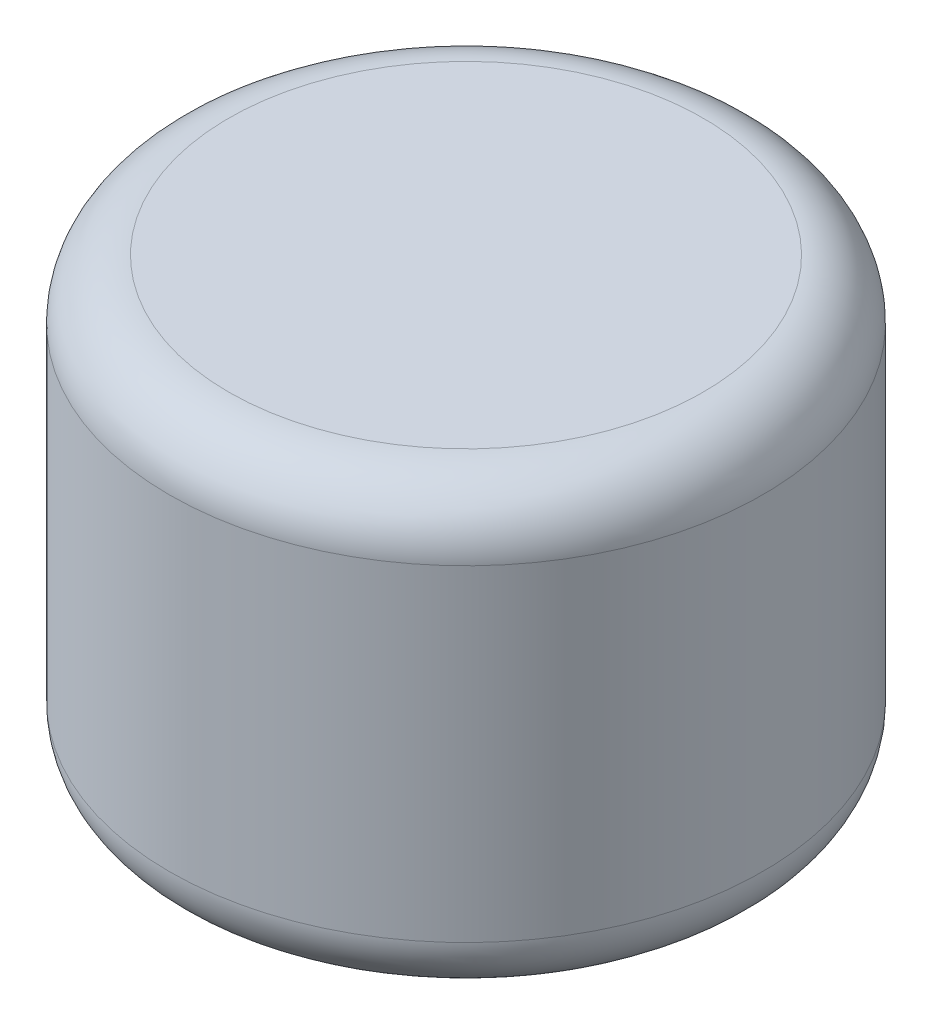
ISO-10303-21;
HEADER;
FILE_DESCRIPTION(('STEP AP214'),'2;1');
FILE_NAME('part.step','',(''),(''),'','','');
FILE_SCHEMA(('AUTOMOTIVE_DESIGN { 1 0 10303 214 1 1 1 1 }'));
ENDSEC;
DATA;
#1=APPLICATION_CONTEXT('core data for automotive mechanical design processes');
#2=APPLICATION_PROTOCOL_DEFINITION('international standard','automotive_design',2000,#1);
#3=PRODUCT_CONTEXT('',#1,'mechanical');
#4=PRODUCT('Part','Part','',(#3));
#5=PRODUCT_RELATED_PRODUCT_CATEGORY('part','',(#4));
#6=PRODUCT_DEFINITION_FORMATION('','',#4);
#7=PRODUCT_DEFINITION_CONTEXT('part definition',#1,'design');
#8=PRODUCT_DEFINITION('design','',#6,#7);
#9=PRODUCT_DEFINITION_SHAPE('','',#8);
#10=(LENGTH_UNIT() NAMED_UNIT(*) SI_UNIT(.MILLI.,.METRE.));
#11=(NAMED_UNIT(*) PLANE_ANGLE_UNIT() SI_UNIT($,.RADIAN.));
#12=(NAMED_UNIT(*) SI_UNIT($,.STERADIAN.) SOLID_ANGLE_UNIT());
#13=UNCERTAINTY_MEASURE_WITH_UNIT(LENGTH_MEASURE(1.E-05),#10,'distance_accuracy_value','');
#14=(GEOMETRIC_REPRESENTATION_CONTEXT(3) GLOBAL_UNCERTAINTY_ASSIGNED_CONTEXT((#13)) GLOBAL_UNIT_ASSIGNED_CONTEXT((#10,
#11,#12)) REPRESENTATION_CONTEXT('',''));
#15=CARTESIAN_POINT('',(0.,0.,0.));
#16=DIRECTION('',(0.,0.,1.));
#17=DIRECTION('',(1.,0.,0.));
#18=AXIS2_PLACEMENT_3D('',#15,#16,#17);
#19=CARTESIAN_POINT('',(0.,1.5,0.));
#20=DIRECTION('',(0.,-1.,0.));
#21=DIRECTION('',(0.,0.,-1.));
#22=AXIS2_PLACEMENT_3D('',#19,#20,#21);
#23=CYLINDRICAL_SURFACE('',#22,2.);
#24=CARTESIAN_POINT('',(0.,-1.1,0.));
#25=DIRECTION('',(0.,1.,0.));
#26=DIRECTION('',(0.,0.,1.));
#27=AXIS2_PLACEMENT_3D('',#24,#25,#26);
#28=CIRCLE('',#27,2.);
#29=CARTESIAN_POINT('',(0.,-1.1,2.));
#30=VERTEX_POINT('',#29);
#31=EDGE_CURVE('E54',#30,#30,#28,.T.);
#32=ORIENTED_EDGE('',*,*,#31,.T.);
#33=EDGE_LOOP('',(#32));
#34=FACE_BOUND('',#33,.T.);
#35=CARTESIAN_POINT('',(0.,1.1,0.));
#36=DIRECTION('',(0.,1.,0.));
#37=DIRECTION('',(0.,0.,1.));
#38=AXIS2_PLACEMENT_3D('',#35,#36,#37);
#39=CIRCLE('',#38,2.);
#40=CARTESIAN_POINT('',(0.,1.1,2.));
#41=VERTEX_POINT('',#40);
#42=EDGE_CURVE('E59',#41,#41,#39,.F.);
#43=ORIENTED_EDGE('',*,*,#42,.T.);
#44=EDGE_LOOP('',(#43));
#45=FACE_BOUND('',#44,.T.);
#46=ADVANCED_FACE('F41',(#34,#45),#23,.T.);
#47=CARTESIAN_POINT('',(0.,1.5,0.));
#48=DIRECTION('',(0.,1.,0.));
#49=DIRECTION('',(0.,0.,1.));
#50=AXIS2_PLACEMENT_3D('',#47,#48,#49);
#51=PLANE('',#50);
#52=CARTESIAN_POINT('',(0.,1.5,0.));
#53=DIRECTION('',(0.,1.,0.));
#54=DIRECTION('',(0.,0.,1.));
#55=AXIS2_PLACEMENT_3D('',#52,#53,#54);
#56=CIRCLE('',#55,1.6);
#57=CARTESIAN_POINT('',(0.,1.5,1.6));
#58=VERTEX_POINT('',#57);
#59=EDGE_CURVE('E10',#58,#58,#56,.T.);
#60=ORIENTED_EDGE('',*,*,#59,.T.);
#61=EDGE_LOOP('',(#60));
#62=FACE_BOUND('',#61,.T.);
#63=ADVANCED_FACE('F76',(#62),#51,.T.);
#64=CARTESIAN_POINT('',(0.,-1.5,0.));
#65=DIRECTION('',(0.,1.,0.));
#66=DIRECTION('',(0.,0.,1.));
#67=AXIS2_PLACEMENT_3D('',#64,#65,#66);
#68=PLANE('',#67);
#69=CARTESIAN_POINT('',(0.,-1.5,0.));
#70=DIRECTION('',(0.,1.,0.));
#71=DIRECTION('',(0.,0.,1.));
#72=AXIS2_PLACEMENT_3D('',#69,#70,#71);
#73=CIRCLE('',#72,1.6);
#74=CARTESIAN_POINT('',(0.,-1.5,1.6));
#75=VERTEX_POINT('',#74);
#76=EDGE_CURVE('E49',#75,#75,#73,.F.);
#77=ORIENTED_EDGE('',*,*,#76,.T.);
#78=EDGE_LOOP('',(#77));
#79=FACE_BOUND('',#78,.T.);
#80=ADVANCED_FACE('F73',(#79),#68,.F.);
#81=CARTESIAN_POINT('',(0.,-1.1,0.));
#82=DIRECTION('',(0.,1.,0.));
#83=DIRECTION('',(0.,0.,1.));
#84=AXIS2_PLACEMENT_3D('',#81,#82,#83);
#85=TOROIDAL_SURFACE('',#84,1.6,0.4);
#86=ORIENTED_EDGE('',*,*,#76,.F.);
#87=EDGE_LOOP('',(#86));
#88=FACE_BOUND('',#87,.T.);
#89=ORIENTED_EDGE('',*,*,#31,.F.);
#90=EDGE_LOOP('',(#89));
#91=FACE_BOUND('',#90,.T.);
#92=ADVANCED_FACE('F69',(#88,#91),#85,.T.);
#93=CARTESIAN_POINT('',(0.,1.1,0.));
#94=DIRECTION('',(0.,1.,0.));
#95=DIRECTION('',(0.,0.,1.));
#96=AXIS2_PLACEMENT_3D('',#93,#94,#95);
#97=TOROIDAL_SURFACE('',#96,1.6,0.4);
#98=ORIENTED_EDGE('',*,*,#42,.F.);
#99=EDGE_LOOP('',(#98));
#100=FACE_BOUND('',#99,.T.);
#101=ORIENTED_EDGE('',*,*,#59,.F.);
#102=EDGE_LOOP('',(#101));
#103=FACE_BOUND('',#102,.T.);
#104=ADVANCED_FACE('F43',(#100,#103),#97,.T.);
#105=CLOSED_SHELL('',(#46,#63,#80,#92,#104));
#106=MANIFOLD_SOLID_BREP('B2',#105);
#107=ADVANCED_BREP_SHAPE_REPRESENTATION('',(#18,#106),#14);
#108=SHAPE_DEFINITION_REPRESENTATION(#9,#107);
ENDSEC;
END-ISO-10303-21;
